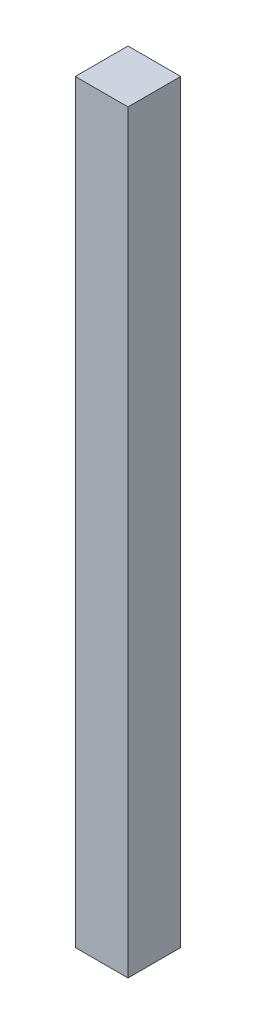
ISO-10303-21;
HEADER;
FILE_DESCRIPTION(('STEP AP214'),'2;1');
FILE_NAME('part.step','',(''),(''),'','','');
FILE_SCHEMA(('AUTOMOTIVE_DESIGN { 1 0 10303 214 1 1 1 1 }'));
ENDSEC;
DATA;
#1=APPLICATION_CONTEXT('core data for automotive mechanical design processes');
#2=APPLICATION_PROTOCOL_DEFINITION('international standard','automotive_design',2000,#1);
#3=PRODUCT_CONTEXT('',#1,'mechanical');
#4=PRODUCT('Part','Part','',(#3));
#5=PRODUCT_RELATED_PRODUCT_CATEGORY('part','',(#4));
#6=PRODUCT_DEFINITION_FORMATION('','',#4);
#7=PRODUCT_DEFINITION_CONTEXT('part definition',#1,'design');
#8=PRODUCT_DEFINITION('design','',#6,#7);
#9=PRODUCT_DEFINITION_SHAPE('','',#8);
#10=(LENGTH_UNIT() NAMED_UNIT(*) SI_UNIT(.MILLI.,.METRE.));
#11=(NAMED_UNIT(*) PLANE_ANGLE_UNIT() SI_UNIT($,.RADIAN.));
#12=(NAMED_UNIT(*) SI_UNIT($,.STERADIAN.) SOLID_ANGLE_UNIT());
#13=UNCERTAINTY_MEASURE_WITH_UNIT(LENGTH_MEASURE(1.E-05),#10,'distance_accuracy_value','');
#14=(GEOMETRIC_REPRESENTATION_CONTEXT(3) GLOBAL_UNCERTAINTY_ASSIGNED_CONTEXT((#13)) GLOBAL_UNIT_ASSIGNED_CONTEXT((#10,
#11,#12)) REPRESENTATION_CONTEXT('',''));
#15=CARTESIAN_POINT('',(0.,0.,0.));
#16=DIRECTION('',(0.,0.,1.));
#17=DIRECTION('',(1.,0.,0.));
#18=AXIS2_PLACEMENT_3D('',#15,#16,#17);
#19=CARTESIAN_POINT('',(5.24404424,150.,-5.24404424));
#20=DIRECTION('',(-1.,0.,0.));
#21=DIRECTION('',(0.,0.,1.));
#22=AXIS2_PLACEMENT_3D('',#19,#20,#21);
#23=PLANE('',#22);
#24=DIRECTION('',(0.,0.,-1.));
#25=VECTOR('',#24,1.);
#26=CARTESIAN_POINT('',(5.24404424,0.,-5.24404424));
#27=LINE('',#26,#25);
#28=CARTESIAN_POINT('',(5.24404424,0.,5.24404424));
#29=VERTEX_POINT('',#28);
#30=CARTESIAN_POINT('',(5.24404424,0.,-5.24404424));
#31=VERTEX_POINT('',#30);
#32=EDGE_CURVE('E113',#29,#31,#27,.T.);
#33=ORIENTED_EDGE('',*,*,#32,.T.);
#34=DIRECTION('',(0.,-1.,0.));
#35=VECTOR('',#34,1.);
#36=CARTESIAN_POINT('',(5.24404424,150.,-5.24404424));
#37=LINE('',#36,#35);
#38=CARTESIAN_POINT('',(5.24404424,150.,-5.24404424));
#39=VERTEX_POINT('',#38);
#40=EDGE_CURVE('E11',#39,#31,#37,.T.);
#41=ORIENTED_EDGE('',*,*,#40,.F.);
#42=DIRECTION('',(0.,0.,-1.));
#43=VECTOR('',#42,1.);
#44=CARTESIAN_POINT('',(5.24404424,150.,-5.24404424));
#45=LINE('',#44,#43);
#46=CARTESIAN_POINT('',(5.24404424,150.,5.24404424));
#47=VERTEX_POINT('',#46);
#48=EDGE_CURVE('E97',#47,#39,#45,.T.);
#49=ORIENTED_EDGE('',*,*,#48,.F.);
#50=DIRECTION('',(0.,-1.,0.));
#51=VECTOR('',#50,1.);
#52=CARTESIAN_POINT('',(5.24404424,150.,5.24404424));
#53=LINE('',#52,#51);
#54=EDGE_CURVE('E109',#47,#29,#53,.T.);
#55=ORIENTED_EDGE('',*,*,#54,.T.);
#56=EDGE_LOOP('',(#33,#41,#49,#55));
#57=FACE_BOUND('',#56,.T.);
#58=ADVANCED_FACE('F45',(#57),#23,.F.);
#59=CARTESIAN_POINT('',(-5.24404424,150.,-5.24404424));
#60=DIRECTION('',(0.,0.,1.));
#61=DIRECTION('',(1.,0.,0.));
#62=AXIS2_PLACEMENT_3D('',#59,#60,#61);
#63=PLANE('',#62);
#64=DIRECTION('',(-1.,0.,0.));
#65=VECTOR('',#64,1.);
#66=CARTESIAN_POINT('',(-5.24404424,0.,-5.24404424));
#67=LINE('',#66,#65);
#68=CARTESIAN_POINT('',(-5.24404424,0.,-5.24404424));
#69=VERTEX_POINT('',#68);
#70=EDGE_CURVE('E102',#31,#69,#67,.T.);
#71=ORIENTED_EDGE('',*,*,#70,.T.);
#72=DIRECTION('',(0.,-1.,0.));
#73=VECTOR('',#72,1.);
#74=CARTESIAN_POINT('',(-5.24404424,150.,-5.24404424));
#75=LINE('',#74,#73);
#76=CARTESIAN_POINT('',(-5.24404424,150.,-5.24404424));
#77=VERTEX_POINT('',#76);
#78=EDGE_CURVE('E54',#77,#69,#75,.T.);
#79=ORIENTED_EDGE('',*,*,#78,.F.);
#80=DIRECTION('',(-1.,0.,0.));
#81=VECTOR('',#80,1.);
#82=CARTESIAN_POINT('',(-5.24404424,150.,-5.24404424));
#83=LINE('',#82,#81);
#84=EDGE_CURVE('E92',#39,#77,#83,.T.);
#85=ORIENTED_EDGE('',*,*,#84,.F.);
#86=ORIENTED_EDGE('',*,*,#40,.T.);
#87=EDGE_LOOP('',(#71,#79,#85,#86));
#88=FACE_BOUND('',#87,.T.);
#89=ADVANCED_FACE('F101',(#88),#63,.F.);
#90=CARTESIAN_POINT('',(-5.24404424,150.,-5.24404424));
#91=DIRECTION('',(1.,0.,0.));
#92=DIRECTION('',(0.,0.,-1.));
#93=AXIS2_PLACEMENT_3D('',#90,#91,#92);
#94=PLANE('',#93);
#95=DIRECTION('',(0.,0.,1.));
#96=VECTOR('',#95,1.);
#97=CARTESIAN_POINT('',(-5.24404424,0.,-5.24404424));
#98=LINE('',#97,#96);
#99=CARTESIAN_POINT('',(-5.24404424,0.,5.24404424));
#100=VERTEX_POINT('',#99);
#101=EDGE_CURVE('E79',#69,#100,#98,.T.);
#102=ORIENTED_EDGE('',*,*,#101,.T.);
#103=DIRECTION('',(0.,-1.,0.));
#104=VECTOR('',#103,1.);
#105=CARTESIAN_POINT('',(-5.24404424,150.,5.24404424));
#106=LINE('',#105,#104);
#107=CARTESIAN_POINT('',(-5.24404424,150.,5.24404424));
#108=VERTEX_POINT('',#107);
#109=EDGE_CURVE('E104',#108,#100,#106,.T.);
#110=ORIENTED_EDGE('',*,*,#109,.F.);
#111=DIRECTION('',(0.,0.,1.));
#112=VECTOR('',#111,1.);
#113=CARTESIAN_POINT('',(-5.24404424,150.,-5.24404424));
#114=LINE('',#113,#112);
#115=EDGE_CURVE('E95',#77,#108,#114,.T.);
#116=ORIENTED_EDGE('',*,*,#115,.F.);
#117=ORIENTED_EDGE('',*,*,#78,.T.);
#118=EDGE_LOOP('',(#102,#110,#116,#117));
#119=FACE_BOUND('',#118,.T.);
#120=ADVANCED_FACE('F105',(#119),#94,.F.);
#121=CARTESIAN_POINT('',(-5.24404424,150.,5.24404424));
#122=DIRECTION('',(0.,0.,-1.));
#123=DIRECTION('',(-1.,0.,0.));
#124=AXIS2_PLACEMENT_3D('',#121,#122,#123);
#125=PLANE('',#124);
#126=DIRECTION('',(1.,0.,0.));
#127=VECTOR('',#126,1.);
#128=CARTESIAN_POINT('',(-5.24404424,0.,5.24404424));
#129=LINE('',#128,#127);
#130=EDGE_CURVE('E85',#100,#29,#129,.T.);
#131=ORIENTED_EDGE('',*,*,#130,.T.);
#132=ORIENTED_EDGE('',*,*,#54,.F.);
#133=DIRECTION('',(1.,0.,0.));
#134=VECTOR('',#133,1.);
#135=CARTESIAN_POINT('',(-5.24404424,150.,5.24404424));
#136=LINE('',#135,#134);
#137=EDGE_CURVE('E62',#108,#47,#136,.T.);
#138=ORIENTED_EDGE('',*,*,#137,.F.);
#139=ORIENTED_EDGE('',*,*,#109,.T.);
#140=EDGE_LOOP('',(#131,#132,#138,#139));
#141=FACE_BOUND('',#140,.T.);
#142=ADVANCED_FACE('F126',(#141),#125,.F.);
#143=CARTESIAN_POINT('',(0.,150.,0.));
#144=DIRECTION('',(0.,1.,0.));
#145=DIRECTION('',(0.,0.,1.));
#146=AXIS2_PLACEMENT_3D('',#143,#144,#145);
#147=PLANE('',#146);
#148=ORIENTED_EDGE('',*,*,#48,.T.);
#149=ORIENTED_EDGE('',*,*,#84,.T.);
#150=ORIENTED_EDGE('',*,*,#115,.T.);
#151=ORIENTED_EDGE('',*,*,#137,.T.);
#152=EDGE_LOOP('',(#148,#149,#150,#151));
#153=FACE_BOUND('',#152,.T.);
#154=ADVANCED_FACE('F93',(#153),#147,.T.);
#155=CARTESIAN_POINT('',(0.,0.,0.));
#156=DIRECTION('',(0.,1.,0.));
#157=DIRECTION('',(0.,0.,1.));
#158=AXIS2_PLACEMENT_3D('',#155,#156,#157);
#159=PLANE('',#158);
#160=ORIENTED_EDGE('',*,*,#32,.F.);
#161=ORIENTED_EDGE('',*,*,#130,.F.);
#162=ORIENTED_EDGE('',*,*,#101,.F.);
#163=ORIENTED_EDGE('',*,*,#70,.F.);
#164=EDGE_LOOP('',(#160,#161,#162,#163));
#165=FACE_BOUND('',#164,.T.);
#166=ADVANCED_FACE('F129',(#165),#159,.F.);
#167=CLOSED_SHELL('',(#58,#89,#120,#142,#154,#166));
#168=MANIFOLD_SOLID_BREP('B2',#167);
#169=ADVANCED_BREP_SHAPE_REPRESENTATION('',(#18,#168),#14);
#170=SHAPE_DEFINITION_REPRESENTATION(#9,#169);
ENDSEC;
END-ISO-10303-21;
